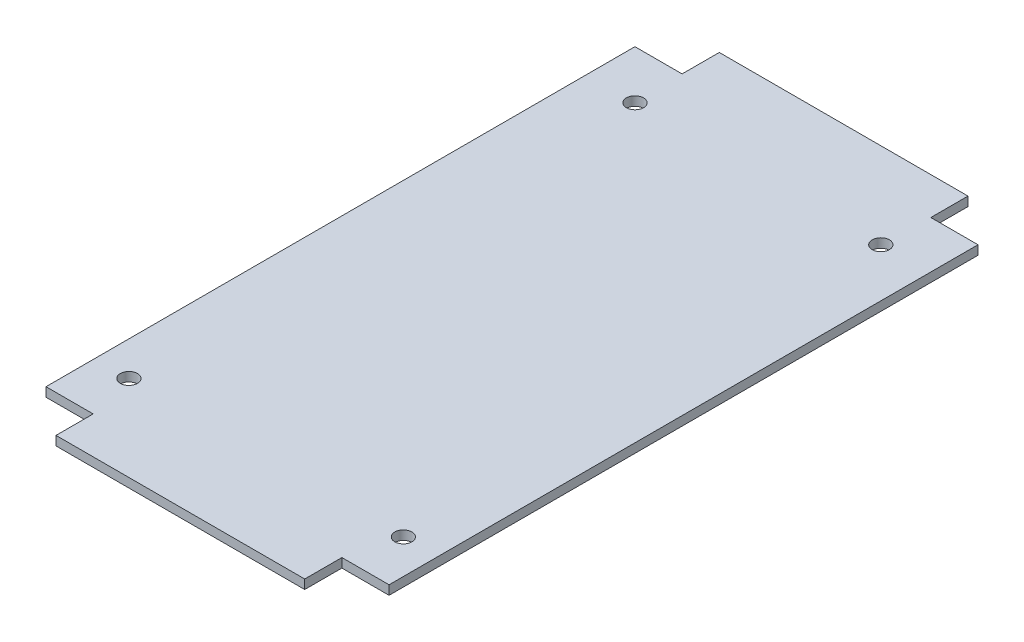
ISO-10303-21;
HEADER;
FILE_DESCRIPTION(('STEP AP214'),'2;1');
FILE_NAME('part.step','',(''),(''),'','','');
FILE_SCHEMA(('AUTOMOTIVE_DESIGN { 1 0 10303 214 1 1 1 1 }'));
ENDSEC;
DATA;
#1=APPLICATION_CONTEXT('core data for automotive mechanical design processes');
#2=APPLICATION_PROTOCOL_DEFINITION('international standard','automotive_design',2000,#1);
#3=PRODUCT_CONTEXT('',#1,'mechanical');
#4=PRODUCT('Part','Part','',(#3));
#5=PRODUCT_RELATED_PRODUCT_CATEGORY('part','',(#4));
#6=PRODUCT_DEFINITION_FORMATION('','',#4);
#7=PRODUCT_DEFINITION_CONTEXT('part definition',#1,'design');
#8=PRODUCT_DEFINITION('design','',#6,#7);
#9=PRODUCT_DEFINITION_SHAPE('','',#8);
#10=(LENGTH_UNIT() NAMED_UNIT(*) SI_UNIT(.MILLI.,.METRE.));
#11=(NAMED_UNIT(*) PLANE_ANGLE_UNIT() SI_UNIT($,.RADIAN.));
#12=(NAMED_UNIT(*) SI_UNIT($,.STERADIAN.) SOLID_ANGLE_UNIT());
#13=UNCERTAINTY_MEASURE_WITH_UNIT(LENGTH_MEASURE(1.E-05),#10,'distance_accuracy_value','');
#14=(GEOMETRIC_REPRESENTATION_CONTEXT(3) GLOBAL_UNCERTAINTY_ASSIGNED_CONTEXT((#13)) GLOBAL_UNIT_ASSIGNED_CONTEXT((#10,
#11,#12)) REPRESENTATION_CONTEXT('',''));
#15=CARTESIAN_POINT('',(0.,0.,0.));
#16=DIRECTION('',(0.,0.,1.));
#17=DIRECTION('',(1.,0.,0.));
#18=AXIS2_PLACEMENT_3D('',#15,#16,#17);
#19=CARTESIAN_POINT('',(21.75,0.,-51.5));
#20=DIRECTION('',(0.,-1.,0.));
#21=DIRECTION('',(0.,0.,-1.));
#22=AXIS2_PLACEMENT_3D('',#19,#20,#21);
#23=PLANE('',#22);
#24=DIRECTION('',(0.,0.,-1.));
#25=VECTOR('',#24,1.);
#26=CARTESIAN_POINT('',(21.75,0.,-51.5));
#27=LINE('',#26,#25);
#28=CARTESIAN_POINT('',(21.75,0.,-58.));
#29=VERTEX_POINT('',#28);
#30=CARTESIAN_POINT('',(21.75,0.,-51.5));
#31=VERTEX_POINT('',#30);
#32=EDGE_CURVE('E475',#29,#31,#27,.F.);
#33=ORIENTED_EDGE('',*,*,#32,.F.);
#34=DIRECTION('',(-1.,0.,0.));
#35=VECTOR('',#34,1.);
#36=CARTESIAN_POINT('',(-21.75,0.,-58.));
#37=LINE('',#36,#35);
#38=CARTESIAN_POINT('',(-21.75,0.,-58.));
#39=VERTEX_POINT('',#38);
#40=EDGE_CURVE('E480',#39,#29,#37,.F.);
#41=ORIENTED_EDGE('',*,*,#40,.F.);
#42=DIRECTION('',(0.,0.,1.));
#43=VECTOR('',#42,1.);
#44=CARTESIAN_POINT('',(-21.75,0.,-51.5));
#45=LINE('',#44,#43);
#46=CARTESIAN_POINT('',(-21.75,0.,-51.5));
#47=VERTEX_POINT('',#46);
#48=EDGE_CURVE('E485',#47,#39,#45,.F.);
#49=ORIENTED_EDGE('',*,*,#48,.F.);
#50=DIRECTION('',(-1.,0.,0.));
#51=VECTOR('',#50,1.);
#52=CARTESIAN_POINT('',(-30.,0.,-51.5));
#53=LINE('',#52,#51);
#54=CARTESIAN_POINT('',(-30.,0.,-51.5));
#55=VERTEX_POINT('',#54);
#56=EDGE_CURVE('E491',#55,#47,#53,.F.);
#57=ORIENTED_EDGE('',*,*,#56,.F.);
#58=DIRECTION('',(0.,0.,1.));
#59=VECTOR('',#58,1.);
#60=CARTESIAN_POINT('',(-30.,0.,-51.5));
#61=LINE('',#60,#59);
#62=CARTESIAN_POINT('',(-30.,0.,51.5));
#63=VERTEX_POINT('',#62);
#64=EDGE_CURVE('E497',#63,#55,#61,.F.);
#65=ORIENTED_EDGE('',*,*,#64,.F.);
#66=DIRECTION('',(1.,0.,0.));
#67=VECTOR('',#66,1.);
#68=CARTESIAN_POINT('',(-30.,0.,51.5));
#69=LINE('',#68,#67);
#70=CARTESIAN_POINT('',(-21.75,0.,51.5));
#71=VERTEX_POINT('',#70);
#72=EDGE_CURVE('E503',#71,#63,#69,.F.);
#73=ORIENTED_EDGE('',*,*,#72,.F.);
#74=DIRECTION('',(0.,0.,1.));
#75=VECTOR('',#74,1.);
#76=CARTESIAN_POINT('',(-21.75,0.,51.5));
#77=LINE('',#76,#75);
#78=CARTESIAN_POINT('',(-21.75,0.,58.));
#79=VERTEX_POINT('',#78);
#80=EDGE_CURVE('E509',#79,#71,#77,.F.);
#81=ORIENTED_EDGE('',*,*,#80,.F.);
#82=DIRECTION('',(1.,0.,0.));
#83=VECTOR('',#82,1.);
#84=CARTESIAN_POINT('',(-21.75,0.,58.));
#85=LINE('',#84,#83);
#86=CARTESIAN_POINT('',(21.75,0.,58.));
#87=VERTEX_POINT('',#86);
#88=EDGE_CURVE('E515',#87,#79,#85,.F.);
#89=ORIENTED_EDGE('',*,*,#88,.F.);
#90=DIRECTION('',(0.,0.,-1.));
#91=VECTOR('',#90,1.);
#92=CARTESIAN_POINT('',(21.75,0.,51.5));
#93=LINE('',#92,#91);
#94=CARTESIAN_POINT('',(21.75,0.,51.5));
#95=VERTEX_POINT('',#94);
#96=EDGE_CURVE('E519',#95,#87,#93,.F.);
#97=ORIENTED_EDGE('',*,*,#96,.F.);
#98=DIRECTION('',(1.,0.,0.));
#99=VECTOR('',#98,1.);
#100=CARTESIAN_POINT('',(30.,0.,51.5));
#101=LINE('',#100,#99);
#102=CARTESIAN_POINT('',(30.,0.,51.5));
#103=VERTEX_POINT('',#102);
#104=EDGE_CURVE('E104',#103,#95,#101,.F.);
#105=ORIENTED_EDGE('',*,*,#104,.F.);
#106=DIRECTION('',(0.,0.,-1.));
#107=VECTOR('',#106,1.);
#108=CARTESIAN_POINT('',(30.,0.,-51.5));
#109=LINE('',#108,#107);
#110=CARTESIAN_POINT('',(30.,0.,-51.5));
#111=VERTEX_POINT('',#110);
#112=EDGE_CURVE('E106',#111,#103,#109,.F.);
#113=ORIENTED_EDGE('',*,*,#112,.F.);
#114=DIRECTION('',(-1.,0.,0.));
#115=VECTOR('',#114,1.);
#116=CARTESIAN_POINT('',(30.,0.,-51.5));
#117=LINE('',#116,#115);
#118=EDGE_CURVE('E109',#31,#111,#117,.F.);
#119=ORIENTED_EDGE('',*,*,#118,.F.);
#120=EDGE_LOOP('',(#33,#41,#49,#57,#65,#73,#81,#89,#97,#105,#113,#119));
#121=FACE_BOUND('',#120,.T.);
#122=CARTESIAN_POINT('',(-21.5,0.,-43.));
#123=DIRECTION('',(0.,1.,0.));
#124=DIRECTION('',(0.,0.,1.));
#125=AXIS2_PLACEMENT_3D('',#122,#123,#124);
#126=CIRCLE('',#125,1.5);
#127=CARTESIAN_POINT('',(-21.5,0.,-41.5));
#128=VERTEX_POINT('',#127);
#129=EDGE_CURVE('E122',#128,#128,#126,.F.);
#130=ORIENTED_EDGE('',*,*,#129,.T.);
#131=EDGE_LOOP('',(#130));
#132=FACE_BOUND('',#131,.T.);
#133=CARTESIAN_POINT('',(-24.,0.,43.));
#134=DIRECTION('',(0.,1.,0.));
#135=DIRECTION('',(0.,0.,1.));
#136=AXIS2_PLACEMENT_3D('',#133,#134,#135);
#137=CIRCLE('',#136,1.5);
#138=CARTESIAN_POINT('',(-24.,0.,44.5));
#139=VERTEX_POINT('',#138);
#140=EDGE_CURVE('E148',#139,#139,#137,.F.);
#141=ORIENTED_EDGE('',*,*,#140,.T.);
#142=EDGE_LOOP('',(#141));
#143=FACE_BOUND('',#142,.T.);
#144=CARTESIAN_POINT('',(24.,0.,43.));
#145=DIRECTION('',(0.,1.,0.));
#146=DIRECTION('',(0.,0.,1.));
#147=AXIS2_PLACEMENT_3D('',#144,#145,#146);
#148=CIRCLE('',#147,1.5);
#149=CARTESIAN_POINT('',(24.,0.,44.5));
#150=VERTEX_POINT('',#149);
#151=EDGE_CURVE('E150',#150,#150,#148,.F.);
#152=ORIENTED_EDGE('',*,*,#151,.T.);
#153=EDGE_LOOP('',(#152));
#154=FACE_BOUND('',#153,.T.);
#155=CARTESIAN_POINT('',(21.5,0.,-43.));
#156=DIRECTION('',(0.,1.,0.));
#157=DIRECTION('',(0.,0.,1.));
#158=AXIS2_PLACEMENT_3D('',#155,#156,#157);
#159=CIRCLE('',#158,1.5);
#160=CARTESIAN_POINT('',(21.5,0.,-41.5));
#161=VERTEX_POINT('',#160);
#162=EDGE_CURVE('E20',#161,#161,#159,.F.);
#163=ORIENTED_EDGE('',*,*,#162,.T.);
#164=EDGE_LOOP('',(#163));
#165=FACE_BOUND('',#164,.T.);
#166=ADVANCED_FACE('F17',(#121,#132,#143,#154,#165),#23,.F.);
#167=CARTESIAN_POINT('',(21.5,-1.6,-43.));
#168=DIRECTION('',(0.,1.,0.));
#169=DIRECTION('',(0.,0.,1.));
#170=AXIS2_PLACEMENT_3D('',#167,#168,#169);
#171=CYLINDRICAL_SURFACE('',#170,1.5);
#172=ORIENTED_EDGE('',*,*,#162,.F.);
#173=EDGE_LOOP('',(#172));
#174=FACE_BOUND('',#173,.T.);
#175=CARTESIAN_POINT('',(21.5,-1.6,-43.));
#176=DIRECTION('',(0.,1.,0.));
#177=DIRECTION('',(0.,0.,1.));
#178=AXIS2_PLACEMENT_3D('',#175,#176,#177);
#179=CIRCLE('',#178,1.5);
#180=CARTESIAN_POINT('',(21.5,-1.6,-41.5));
#181=VERTEX_POINT('',#180);
#182=EDGE_CURVE('E143',#181,#181,#179,.T.);
#183=ORIENTED_EDGE('',*,*,#182,.F.);
#184=EDGE_LOOP('',(#183));
#185=FACE_BOUND('',#184,.T.);
#186=ADVANCED_FACE('F158',(#174,#185),#171,.F.);
#187=CARTESIAN_POINT('',(24.,-1.6,43.));
#188=DIRECTION('',(0.,1.,0.));
#189=DIRECTION('',(0.,0.,1.));
#190=AXIS2_PLACEMENT_3D('',#187,#188,#189);
#191=CYLINDRICAL_SURFACE('',#190,1.5);
#192=ORIENTED_EDGE('',*,*,#151,.F.);
#193=EDGE_LOOP('',(#192));
#194=FACE_BOUND('',#193,.T.);
#195=CARTESIAN_POINT('',(24.,-1.6,43.));
#196=DIRECTION('',(0.,1.,0.));
#197=DIRECTION('',(0.,0.,1.));
#198=AXIS2_PLACEMENT_3D('',#195,#196,#197);
#199=CIRCLE('',#198,1.5);
#200=CARTESIAN_POINT('',(24.,-1.6,44.5));
#201=VERTEX_POINT('',#200);
#202=EDGE_CURVE('E140',#201,#201,#199,.T.);
#203=ORIENTED_EDGE('',*,*,#202,.F.);
#204=EDGE_LOOP('',(#203));
#205=FACE_BOUND('',#204,.T.);
#206=ADVANCED_FACE('F161',(#194,#205),#191,.F.);
#207=CARTESIAN_POINT('',(-24.,-1.6,43.));
#208=DIRECTION('',(0.,1.,0.));
#209=DIRECTION('',(0.,0.,1.));
#210=AXIS2_PLACEMENT_3D('',#207,#208,#209);
#211=CYLINDRICAL_SURFACE('',#210,1.5);
#212=ORIENTED_EDGE('',*,*,#140,.F.);
#213=EDGE_LOOP('',(#212));
#214=FACE_BOUND('',#213,.T.);
#215=CARTESIAN_POINT('',(-24.,-1.6,43.));
#216=DIRECTION('',(0.,1.,0.));
#217=DIRECTION('',(0.,0.,1.));
#218=AXIS2_PLACEMENT_3D('',#215,#216,#217);
#219=CIRCLE('',#218,1.5);
#220=CARTESIAN_POINT('',(-24.,-1.6,44.5));
#221=VERTEX_POINT('',#220);
#222=EDGE_CURVE('E137',#221,#221,#219,.T.);
#223=ORIENTED_EDGE('',*,*,#222,.F.);
#224=EDGE_LOOP('',(#223));
#225=FACE_BOUND('',#224,.T.);
#226=ADVANCED_FACE('F220',(#214,#225),#211,.F.);
#227=CARTESIAN_POINT('',(-21.5,-1.6,-43.));
#228=DIRECTION('',(0.,1.,0.));
#229=DIRECTION('',(0.,0.,1.));
#230=AXIS2_PLACEMENT_3D('',#227,#228,#229);
#231=CYLINDRICAL_SURFACE('',#230,1.5);
#232=ORIENTED_EDGE('',*,*,#129,.F.);
#233=EDGE_LOOP('',(#232));
#234=FACE_BOUND('',#233,.T.);
#235=CARTESIAN_POINT('',(-21.5,-1.6,-43.));
#236=DIRECTION('',(0.,1.,0.));
#237=DIRECTION('',(0.,0.,1.));
#238=AXIS2_PLACEMENT_3D('',#235,#236,#237);
#239=CIRCLE('',#238,1.5);
#240=CARTESIAN_POINT('',(-21.5,-1.6,-41.5));
#241=VERTEX_POINT('',#240);
#242=EDGE_CURVE('E133',#241,#241,#239,.T.);
#243=ORIENTED_EDGE('',*,*,#242,.F.);
#244=EDGE_LOOP('',(#243));
#245=FACE_BOUND('',#244,.T.);
#246=ADVANCED_FACE('F217',(#234,#245),#231,.F.);
#247=CARTESIAN_POINT('',(30.,-1.6,-51.5));
#248=DIRECTION('',(0.,0.,-1.));
#249=DIRECTION('',(-1.,0.,0.));
#250=AXIS2_PLACEMENT_3D('',#247,#248,#249);
#251=PLANE('',#250);
#252=DIRECTION('',(1.,0.,0.));
#253=VECTOR('',#252,1.);
#254=CARTESIAN_POINT('',(21.75,-1.6,-51.5));
#255=LINE('',#254,#253);
#256=CARTESIAN_POINT('',(21.75,-1.6,-51.5));
#257=VERTEX_POINT('',#256);
#258=CARTESIAN_POINT('',(30.,-1.6,-51.5));
#259=VERTEX_POINT('',#258);
#260=EDGE_CURVE('E136',#257,#259,#255,.T.);
#261=ORIENTED_EDGE('',*,*,#260,.F.);
#262=DIRECTION('',(0.,1.,0.));
#263=VECTOR('',#262,1.);
#264=CARTESIAN_POINT('',(21.75,-1.6,-51.5));
#265=LINE('',#264,#263);
#266=EDGE_CURVE('E120',#31,#257,#265,.F.);
#267=ORIENTED_EDGE('',*,*,#266,.F.);
#268=ORIENTED_EDGE('',*,*,#118,.T.);
#269=DIRECTION('',(0.,1.,0.));
#270=VECTOR('',#269,1.);
#271=CARTESIAN_POINT('',(30.,-1.6,-51.5));
#272=LINE('',#271,#270);
#273=EDGE_CURVE('E114',#259,#111,#272,.T.);
#274=ORIENTED_EDGE('',*,*,#273,.F.);
#275=EDGE_LOOP('',(#261,#267,#268,#274));
#276=FACE_BOUND('',#275,.T.);
#277=ADVANCED_FACE('F117',(#276),#251,.T.);
#278=CARTESIAN_POINT('',(30.,-1.6,-51.5));
#279=DIRECTION('',(1.,0.,0.));
#280=DIRECTION('',(0.,0.,-1.));
#281=AXIS2_PLACEMENT_3D('',#278,#279,#280);
#282=PLANE('',#281);
#283=DIRECTION('',(0.,0.,-1.));
#284=VECTOR('',#283,1.);
#285=CARTESIAN_POINT('',(30.,-1.6,-51.5));
#286=LINE('',#285,#284);
#287=CARTESIAN_POINT('',(30.,-1.6,51.5));
#288=VERTEX_POINT('',#287);
#289=EDGE_CURVE('E126',#259,#288,#286,.F.);
#290=ORIENTED_EDGE('',*,*,#289,.F.);
#291=ORIENTED_EDGE('',*,*,#273,.T.);
#292=ORIENTED_EDGE('',*,*,#112,.T.);
#293=DIRECTION('',(0.,1.,0.));
#294=VECTOR('',#293,1.);
#295=CARTESIAN_POINT('',(30.,-1.6,51.5));
#296=LINE('',#295,#294);
#297=EDGE_CURVE('E129',#288,#103,#296,.T.);
#298=ORIENTED_EDGE('',*,*,#297,.F.);
#299=EDGE_LOOP('',(#290,#291,#292,#298));
#300=FACE_BOUND('',#299,.T.);
#301=ADVANCED_FACE('F124',(#300),#282,.T.);
#302=CARTESIAN_POINT('',(30.,-1.6,51.5));
#303=DIRECTION('',(0.,0.,1.));
#304=DIRECTION('',(1.,0.,0.));
#305=AXIS2_PLACEMENT_3D('',#302,#303,#304);
#306=PLANE('',#305);
#307=DIRECTION('',(1.,0.,0.));
#308=VECTOR('',#307,1.);
#309=CARTESIAN_POINT('',(21.75,-1.6,51.5));
#310=LINE('',#309,#308);
#311=CARTESIAN_POINT('',(21.75,-1.6,51.5));
#312=VERTEX_POINT('',#311);
#313=EDGE_CURVE('E462',#288,#312,#310,.F.);
#314=ORIENTED_EDGE('',*,*,#313,.F.);
#315=ORIENTED_EDGE('',*,*,#297,.T.);
#316=ORIENTED_EDGE('',*,*,#104,.T.);
#317=DIRECTION('',(0.,1.,0.));
#318=VECTOR('',#317,1.);
#319=CARTESIAN_POINT('',(21.75,-1.6,51.5));
#320=LINE('',#319,#318);
#321=EDGE_CURVE('E464',#312,#95,#320,.T.);
#322=ORIENTED_EDGE('',*,*,#321,.F.);
#323=EDGE_LOOP('',(#314,#315,#316,#322));
#324=FACE_BOUND('',#323,.T.);
#325=ADVANCED_FACE('F208',(#324),#306,.T.);
#326=CARTESIAN_POINT('',(21.75,-1.6,51.5));
#327=DIRECTION('',(1.,0.,0.));
#328=DIRECTION('',(0.,0.,-1.));
#329=AXIS2_PLACEMENT_3D('',#326,#327,#328);
#330=PLANE('',#329);
#331=DIRECTION('',(0.,0.,-1.));
#332=VECTOR('',#331,1.);
#333=CARTESIAN_POINT('',(21.75,-1.6,-51.5));
#334=LINE('',#333,#332);
#335=CARTESIAN_POINT('',(21.75,-1.6,58.));
#336=VERTEX_POINT('',#335);
#337=EDGE_CURVE('E467',#312,#336,#334,.F.);
#338=ORIENTED_EDGE('',*,*,#337,.F.);
#339=ORIENTED_EDGE('',*,*,#321,.T.);
#340=ORIENTED_EDGE('',*,*,#96,.T.);
#341=DIRECTION('',(0.,1.,0.));
#342=VECTOR('',#341,1.);
#343=CARTESIAN_POINT('',(21.75,-1.6,58.));
#344=LINE('',#343,#342);
#345=EDGE_CURVE('E512',#336,#87,#344,.T.);
#346=ORIENTED_EDGE('',*,*,#345,.F.);
#347=EDGE_LOOP('',(#338,#339,#340,#346));
#348=FACE_BOUND('',#347,.T.);
#349=ADVANCED_FACE('F204',(#348),#330,.T.);
#350=CARTESIAN_POINT('',(-21.75,-1.6,58.));
#351=DIRECTION('',(0.,0.,1.));
#352=DIRECTION('',(1.,0.,0.));
#353=AXIS2_PLACEMENT_3D('',#350,#351,#352);
#354=PLANE('',#353);
#355=DIRECTION('',(1.,0.,0.));
#356=VECTOR('',#355,1.);
#357=CARTESIAN_POINT('',(21.75,-1.6,58.));
#358=LINE('',#357,#356);
#359=CARTESIAN_POINT('',(-21.75,-1.6,58.));
#360=VERTEX_POINT('',#359);
#361=EDGE_CURVE('E523',#336,#360,#358,.F.);
#362=ORIENTED_EDGE('',*,*,#361,.F.);
#363=ORIENTED_EDGE('',*,*,#345,.T.);
#364=ORIENTED_EDGE('',*,*,#88,.T.);
#365=DIRECTION('',(0.,1.,0.));
#366=VECTOR('',#365,1.);
#367=CARTESIAN_POINT('',(-21.75,-1.6,58.));
#368=LINE('',#367,#366);
#369=EDGE_CURVE('E506',#360,#79,#368,.T.);
#370=ORIENTED_EDGE('',*,*,#369,.F.);
#371=EDGE_LOOP('',(#362,#363,#364,#370));
#372=FACE_BOUND('',#371,.T.);
#373=ADVANCED_FACE('F200',(#372),#354,.T.);
#374=CARTESIAN_POINT('',(-21.75,-1.6,51.5));
#375=DIRECTION('',(-1.,0.,0.));
#376=DIRECTION('',(0.,0.,1.));
#377=AXIS2_PLACEMENT_3D('',#374,#375,#376);
#378=PLANE('',#377);
#379=DIRECTION('',(0.,0.,-1.));
#380=VECTOR('',#379,1.);
#381=CARTESIAN_POINT('',(-21.75,-1.6,-51.5));
#382=LINE('',#381,#380);
#383=CARTESIAN_POINT('',(-21.75,-1.6,51.5));
#384=VERTEX_POINT('',#383);
#385=EDGE_CURVE('E526',#360,#384,#382,.T.);
#386=ORIENTED_EDGE('',*,*,#385,.F.);
#387=ORIENTED_EDGE('',*,*,#369,.T.);
#388=ORIENTED_EDGE('',*,*,#80,.T.);
#389=DIRECTION('',(0.,1.,0.));
#390=VECTOR('',#389,1.);
#391=CARTESIAN_POINT('',(-21.75,-1.6,51.5));
#392=LINE('',#391,#390);
#393=EDGE_CURVE('E500',#384,#71,#392,.T.);
#394=ORIENTED_EDGE('',*,*,#393,.F.);
#395=EDGE_LOOP('',(#386,#387,#388,#394));
#396=FACE_BOUND('',#395,.T.);
#397=ADVANCED_FACE('F196',(#396),#378,.T.);
#398=CARTESIAN_POINT('',(-30.,-1.6,51.5));
#399=DIRECTION('',(0.,0.,1.));
#400=DIRECTION('',(1.,0.,0.));
#401=AXIS2_PLACEMENT_3D('',#398,#399,#400);
#402=PLANE('',#401);
#403=DIRECTION('',(1.,0.,0.));
#404=VECTOR('',#403,1.);
#405=CARTESIAN_POINT('',(21.75,-1.6,51.5));
#406=LINE('',#405,#404);
#407=CARTESIAN_POINT('',(-30.,-1.6,51.5));
#408=VERTEX_POINT('',#407);
#409=EDGE_CURVE('E530',#384,#408,#406,.F.);
#410=ORIENTED_EDGE('',*,*,#409,.F.);
#411=ORIENTED_EDGE('',*,*,#393,.T.);
#412=ORIENTED_EDGE('',*,*,#72,.T.);
#413=DIRECTION('',(0.,1.,0.));
#414=VECTOR('',#413,1.);
#415=CARTESIAN_POINT('',(-30.,-1.6,51.5));
#416=LINE('',#415,#414);
#417=EDGE_CURVE('E494',#408,#63,#416,.T.);
#418=ORIENTED_EDGE('',*,*,#417,.F.);
#419=EDGE_LOOP('',(#410,#411,#412,#418));
#420=FACE_BOUND('',#419,.T.);
#421=ADVANCED_FACE('F192',(#420),#402,.T.);
#422=CARTESIAN_POINT('',(-30.,-1.6,-51.5));
#423=DIRECTION('',(-1.,0.,0.));
#424=DIRECTION('',(0.,0.,1.));
#425=AXIS2_PLACEMENT_3D('',#422,#423,#424);
#426=PLANE('',#425);
#427=DIRECTION('',(0.,0.,-1.));
#428=VECTOR('',#427,1.);
#429=CARTESIAN_POINT('',(-30.,-1.6,-51.5));
#430=LINE('',#429,#428);
#431=CARTESIAN_POINT('',(-30.,-1.6,-51.5));
#432=VERTEX_POINT('',#431);
#433=EDGE_CURVE('E533',#408,#432,#430,.T.);
#434=ORIENTED_EDGE('',*,*,#433,.F.);
#435=ORIENTED_EDGE('',*,*,#417,.T.);
#436=ORIENTED_EDGE('',*,*,#64,.T.);
#437=DIRECTION('',(0.,1.,0.));
#438=VECTOR('',#437,1.);
#439=CARTESIAN_POINT('',(-30.,-1.6,-51.5));
#440=LINE('',#439,#438);
#441=EDGE_CURVE('E488',#432,#55,#440,.T.);
#442=ORIENTED_EDGE('',*,*,#441,.F.);
#443=EDGE_LOOP('',(#434,#435,#436,#442));
#444=FACE_BOUND('',#443,.T.);
#445=ADVANCED_FACE('F188',(#444),#426,.T.);
#446=CARTESIAN_POINT('',(-30.,-1.6,-51.5));
#447=DIRECTION('',(0.,0.,-1.));
#448=DIRECTION('',(-1.,0.,0.));
#449=AXIS2_PLACEMENT_3D('',#446,#447,#448);
#450=PLANE('',#449);
#451=DIRECTION('',(1.,0.,0.));
#452=VECTOR('',#451,1.);
#453=CARTESIAN_POINT('',(21.75,-1.6,-51.5));
#454=LINE('',#453,#452);
#455=CARTESIAN_POINT('',(-21.75,-1.6,-51.5));
#456=VERTEX_POINT('',#455);
#457=EDGE_CURVE('E536',#432,#456,#454,.T.);
#458=ORIENTED_EDGE('',*,*,#457,.F.);
#459=ORIENTED_EDGE('',*,*,#441,.T.);
#460=ORIENTED_EDGE('',*,*,#56,.T.);
#461=DIRECTION('',(0.,1.,0.));
#462=VECTOR('',#461,1.);
#463=CARTESIAN_POINT('',(-21.75,-1.6,-51.5));
#464=LINE('',#463,#462);
#465=EDGE_CURVE('E482',#456,#47,#464,.T.);
#466=ORIENTED_EDGE('',*,*,#465,.F.);
#467=EDGE_LOOP('',(#458,#459,#460,#466));
#468=FACE_BOUND('',#467,.T.);
#469=ADVANCED_FACE('F184',(#468),#450,.T.);
#470=CARTESIAN_POINT('',(-21.75,-1.6,-51.5));
#471=DIRECTION('',(-1.,0.,0.));
#472=DIRECTION('',(0.,0.,1.));
#473=AXIS2_PLACEMENT_3D('',#470,#471,#472);
#474=PLANE('',#473);
#475=DIRECTION('',(0.,0.,-1.));
#476=VECTOR('',#475,1.);
#477=CARTESIAN_POINT('',(-21.75,-1.6,-51.5));
#478=LINE('',#477,#476);
#479=CARTESIAN_POINT('',(-21.75,-1.6,-58.));
#480=VERTEX_POINT('',#479);
#481=EDGE_CURVE('E539',#456,#480,#478,.T.);
#482=ORIENTED_EDGE('',*,*,#481,.F.);
#483=ORIENTED_EDGE('',*,*,#465,.T.);
#484=ORIENTED_EDGE('',*,*,#48,.T.);
#485=DIRECTION('',(0.,1.,0.));
#486=VECTOR('',#485,1.);
#487=CARTESIAN_POINT('',(-21.75,-1.6,-58.));
#488=LINE('',#487,#486);
#489=EDGE_CURVE('E477',#480,#39,#488,.T.);
#490=ORIENTED_EDGE('',*,*,#489,.F.);
#491=EDGE_LOOP('',(#482,#483,#484,#490));
#492=FACE_BOUND('',#491,.T.);
#493=ADVANCED_FACE('F181',(#492),#474,.T.);
#494=CARTESIAN_POINT('',(-21.75,-1.6,-58.));
#495=DIRECTION('',(0.,0.,-1.));
#496=DIRECTION('',(-1.,0.,0.));
#497=AXIS2_PLACEMENT_3D('',#494,#495,#496);
#498=PLANE('',#497);
#499=DIRECTION('',(1.,0.,0.));
#500=VECTOR('',#499,1.);
#501=CARTESIAN_POINT('',(21.75,-1.6,-58.));
#502=LINE('',#501,#500);
#503=CARTESIAN_POINT('',(21.75,-1.6,-58.));
#504=VERTEX_POINT('',#503);
#505=EDGE_CURVE('E26',#480,#504,#502,.T.);
#506=ORIENTED_EDGE('',*,*,#505,.F.);
#507=ORIENTED_EDGE('',*,*,#489,.T.);
#508=ORIENTED_EDGE('',*,*,#40,.T.);
#509=DIRECTION('',(0.,1.,0.));
#510=VECTOR('',#509,1.);
#511=CARTESIAN_POINT('',(21.75,-1.6,-58.));
#512=LINE('',#511,#510);
#513=EDGE_CURVE('E35',#504,#29,#512,.T.);
#514=ORIENTED_EDGE('',*,*,#513,.F.);
#515=EDGE_LOOP('',(#506,#507,#508,#514));
#516=FACE_BOUND('',#515,.T.);
#517=ADVANCED_FACE('F173',(#516),#498,.T.);
#518=CARTESIAN_POINT('',(21.75,-1.6,-51.5));
#519=DIRECTION('',(1.,0.,0.));
#520=DIRECTION('',(0.,0.,-1.));
#521=AXIS2_PLACEMENT_3D('',#518,#519,#520);
#522=PLANE('',#521);
#523=DIRECTION('',(0.,0.,-1.));
#524=VECTOR('',#523,1.);
#525=CARTESIAN_POINT('',(21.75,-1.6,-51.5));
#526=LINE('',#525,#524);
#527=EDGE_CURVE('E11',#504,#257,#526,.F.);
#528=ORIENTED_EDGE('',*,*,#527,.F.);
#529=ORIENTED_EDGE('',*,*,#513,.T.);
#530=ORIENTED_EDGE('',*,*,#32,.T.);
#531=ORIENTED_EDGE('',*,*,#266,.T.);
#532=EDGE_LOOP('',(#528,#529,#530,#531));
#533=FACE_BOUND('',#532,.T.);
#534=ADVANCED_FACE('F166',(#533),#522,.T.);
#535=CARTESIAN_POINT('',(21.75,-1.6,-51.5));
#536=DIRECTION('',(0.,-1.,0.));
#537=DIRECTION('',(0.,0.,-1.));
#538=AXIS2_PLACEMENT_3D('',#535,#536,#537);
#539=PLANE('',#538);
#540=ORIENTED_EDGE('',*,*,#505,.T.);
#541=ORIENTED_EDGE('',*,*,#527,.T.);
#542=ORIENTED_EDGE('',*,*,#260,.T.);
#543=ORIENTED_EDGE('',*,*,#289,.T.);
#544=ORIENTED_EDGE('',*,*,#313,.T.);
#545=ORIENTED_EDGE('',*,*,#337,.T.);
#546=ORIENTED_EDGE('',*,*,#361,.T.);
#547=ORIENTED_EDGE('',*,*,#385,.T.);
#548=ORIENTED_EDGE('',*,*,#409,.T.);
#549=ORIENTED_EDGE('',*,*,#433,.T.);
#550=ORIENTED_EDGE('',*,*,#457,.T.);
#551=ORIENTED_EDGE('',*,*,#481,.T.);
#552=EDGE_LOOP('',(#540,#541,#542,#543,#544,#545,#546,#547,#548,#549,#550,#551));
#553=FACE_BOUND('',#552,.T.);
#554=ORIENTED_EDGE('',*,*,#242,.T.);
#555=EDGE_LOOP('',(#554));
#556=FACE_BOUND('',#555,.T.);
#557=ORIENTED_EDGE('',*,*,#222,.T.);
#558=EDGE_LOOP('',(#557));
#559=FACE_BOUND('',#558,.T.);
#560=ORIENTED_EDGE('',*,*,#202,.T.);
#561=EDGE_LOOP('',(#560));
#562=FACE_BOUND('',#561,.T.);
#563=ORIENTED_EDGE('',*,*,#182,.T.);
#564=EDGE_LOOP('',(#563));
#565=FACE_BOUND('',#564,.T.);
#566=ADVANCED_FACE('F164',(#553,#556,#559,#562,#565),#539,.T.);
#567=CLOSED_SHELL('',(#166,#186,#206,#226,#246,#277,#301,#325,#349,#373,#397,#421,#445,#469,
#493,#517,#534,#566));
#568=MANIFOLD_SOLID_BREP('B1',#567);
#569=ADVANCED_BREP_SHAPE_REPRESENTATION('',(#18,#568),#14);
#570=SHAPE_DEFINITION_REPRESENTATION(#9,#569);
ENDSEC;
END-ISO-10303-21;
